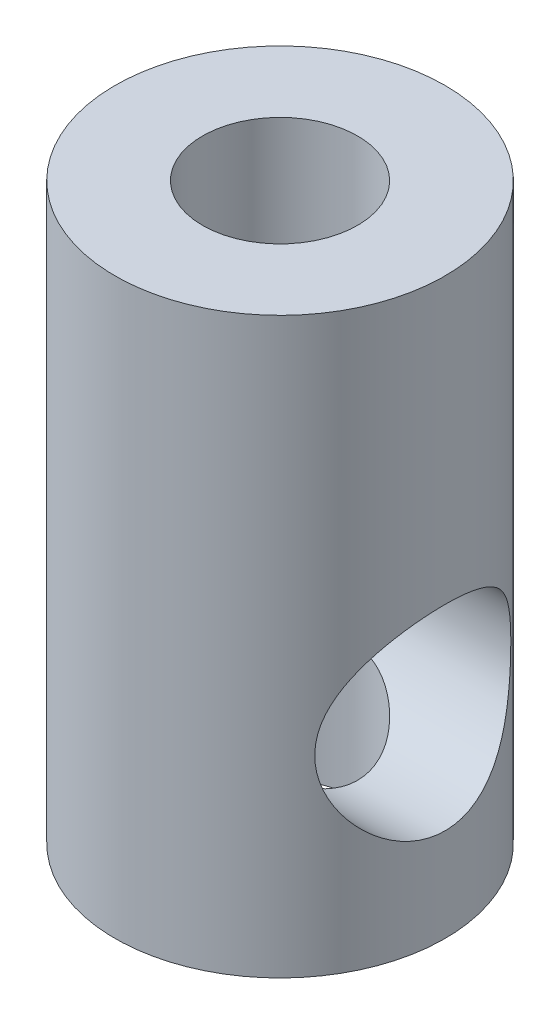
ISO-10303-21;
HEADER;
FILE_DESCRIPTION(('STEP AP214'),'2;1');
FILE_NAME('part.step','',(''),(''),'','','');
FILE_SCHEMA(('AUTOMOTIVE_DESIGN { 1 0 10303 214 1 1 1 1 }'));
ENDSEC;
DATA;
#1=APPLICATION_CONTEXT('core data for automotive mechanical design processes');
#2=APPLICATION_PROTOCOL_DEFINITION('international standard','automotive_design',2000,#1);
#3=PRODUCT_CONTEXT('',#1,'mechanical');
#4=PRODUCT('Part','Part','',(#3));
#5=PRODUCT_RELATED_PRODUCT_CATEGORY('part','',(#4));
#6=PRODUCT_DEFINITION_FORMATION('','',#4);
#7=PRODUCT_DEFINITION_CONTEXT('part definition',#1,'design');
#8=PRODUCT_DEFINITION('design','',#6,#7);
#9=PRODUCT_DEFINITION_SHAPE('','',#8);
#10=(LENGTH_UNIT() NAMED_UNIT(*) SI_UNIT(.MILLI.,.METRE.));
#11=(NAMED_UNIT(*) PLANE_ANGLE_UNIT() SI_UNIT($,.RADIAN.));
#12=(NAMED_UNIT(*) SI_UNIT($,.STERADIAN.) SOLID_ANGLE_UNIT());
#13=UNCERTAINTY_MEASURE_WITH_UNIT(LENGTH_MEASURE(1.E-05),#10,'distance_accuracy_value','');
#14=(GEOMETRIC_REPRESENTATION_CONTEXT(3) GLOBAL_UNCERTAINTY_ASSIGNED_CONTEXT((#13)) GLOBAL_UNIT_ASSIGNED_CONTEXT((#10,
#11,#12)) REPRESENTATION_CONTEXT('',''));
#15=CARTESIAN_POINT('',(0.,0.,0.));
#16=DIRECTION('',(0.,0.,1.));
#17=DIRECTION('',(1.,0.,0.));
#18=AXIS2_PLACEMENT_3D('',#15,#16,#17);
#19=CARTESIAN_POINT('',(0.,0.,0.));
#20=DIRECTION('',(0.,-1.,0.));
#21=DIRECTION('',(0.,0.,-1.));
#22=AXIS2_PLACEMENT_3D('',#19,#20,#21);
#23=CYLINDRICAL_SURFACE('',#22,1.621);
#24=CARTESIAN_POINT('',(0.,2.74506613720085,-1.621));
#25=CARTESIAN_POINT('',(-0.0618838344943443,2.74507314784713,-1.62100303795965));
#26=CARTESIAN_POINT('',(-0.123753923437036,2.74041001839376,-1.61742580648904));
#27=CARTESIAN_POINT('',(-0.245548077429936,2.72269820526634,-1.60347159765317));
#28=CARTESIAN_POINT('',(-0.305467583498045,2.70963117787796,-1.59307974460996));
#29=CARTESIAN_POINT('',(-0.441855724366991,2.67167549543974,-1.56167676736126));
#30=CARTESIAN_POINT('',(-0.517049098267741,2.64428105756333,-1.53826004055569));
#31=CARTESIAN_POINT('',(-0.661104506712127,2.58308809869082,-1.48209063959145));
#32=CARTESIAN_POINT('',(-0.729947369344123,2.54927107144414,-1.44931084533743));
#33=CARTESIAN_POINT('',(-0.883849864405583,2.46687093643185,-1.36260863239398));
#34=CARTESIAN_POINT('',(-0.966412860188456,2.41719066792417,-1.3052891068616));
#35=CARTESIAN_POINT('',(-1.11998184477946,2.31899579598461,-1.17614619810124));
#36=CARTESIAN_POINT('',(-1.19099722423979,2.2704802730153,-1.10433470749768));
#37=CARTESIAN_POINT('',(-1.30741448004819,2.1881341644896,-0.961795820520632));
#38=CARTESIAN_POINT('',(-1.35511379821205,2.15327812500301,-0.893544502039951));
#39=CARTESIAN_POINT('',(-1.44036943977302,2.08983985144661,-0.748356083631552));
#40=CARTESIAN_POINT('',(-1.47794136722123,2.06124797856644,-0.671432607974439));
#41=CARTESIAN_POINT('',(-1.53603227948987,2.01657637847978,-0.523019292399699));
#42=CARTESIAN_POINT('',(-1.5583110113087,1.99923126755153,-0.452603469122464));
#43=CARTESIAN_POINT('',(-1.5931987923943,1.97194135411511,-0.308021253672216));
#44=CARTESIAN_POINT('',(-1.60581302820809,1.96199258237375,-0.233856896000058));
#45=CARTESIAN_POINT('',(-1.62060784053911,1.95031520563182,-0.0835898288305426));
#46=CARTESIAN_POINT('',(-1.62275423239801,1.94861353315467,-0.00748158339559701));
#47=CARTESIAN_POINT('',(-1.61637011622946,1.95365995743185,0.144000645385216));
#48=CARTESIAN_POINT('',(-1.60783889419273,1.96040861925788,0.219374579288184));
#49=CARTESIAN_POINT('',(-1.58137378064278,1.98120338027809,0.363292111490304));
#50=CARTESIAN_POINT('',(-1.56394382245726,1.99485804086783,0.431987821527844));
#51=CARTESIAN_POINT('',(-1.52089453282525,2.02825075136374,0.565176319537256));
#52=CARTESIAN_POINT('',(-1.49527317583841,2.04799030587785,0.629668063213476));
#53=CARTESIAN_POINT('',(-1.43398336321787,2.09455249518729,0.759600226458336));
#54=CARTESIAN_POINT('',(-1.39757254510311,2.12188213081783,0.82450529123297));
#55=CARTESIAN_POINT('',(-1.31735169849772,2.18078779889944,0.947428782374879));
#56=CARTESIAN_POINT('',(-1.27353705925498,2.21236647494132,1.00544287879559));
#57=CARTESIAN_POINT('',(-1.16981404388338,2.28487045121659,1.12547688073274));
#58=CARTESIAN_POINT('',(-1.10844780214715,2.32638463810277,1.18587950931886));
#59=CARTESIAN_POINT('',(-0.977264585306866,2.41023794800863,1.29612932641368));
#60=CARTESIAN_POINT('',(-0.907439330850795,2.45257784464317,1.34596604009144));
#61=CARTESIAN_POINT('',(-0.7684753622988,2.5294639393179,1.42927834909955));
#62=CARTESIAN_POINT('',(-0.700266704048142,2.56433465569014,1.46400152188266));
#63=CARTESIAN_POINT('',(-0.557319490299986,2.6283607645284,1.5241485765311));
#64=CARTESIAN_POINT('',(-0.482590989710124,2.65752474030309,1.54958647471164));
#65=CARTESIAN_POINT('',(-0.340404375629609,2.70115287710556,1.58624516610801));
#66=CARTESIAN_POINT('',(-0.273922199255209,2.71728655323593,1.59916336038962));
#67=CARTESIAN_POINT('',(-0.138281246217461,2.73922227563148,1.61652514107857));
#68=CARTESIAN_POINT('',(-0.0691320460858544,2.74505830542494,1.62099660621602));
#69=CARTESIAN_POINT('',(0.0618838344943542,2.74507314784709,1.62100303795965));
#70=CARTESIAN_POINT('',(0.123753923437046,2.74041001839375,1.61742580648904));
#71=CARTESIAN_POINT('',(0.245548077429942,2.72269820526635,1.60347159765317));
#72=CARTESIAN_POINT('',(0.305467583498048,2.70963117787797,1.59307974460996));
#73=CARTESIAN_POINT('',(0.44185572436699,2.67167549543974,1.56167676736126));
#74=CARTESIAN_POINT('',(0.51704909826774,2.64428105756332,1.53826004055569));
#75=CARTESIAN_POINT('',(0.661104506712126,2.58308809869082,1.48209063959145));
#76=CARTESIAN_POINT('',(0.729947369344122,2.54927107144414,1.44931084533743));
#77=CARTESIAN_POINT('',(0.883849864405583,2.46687093643185,1.36260863239398));
#78=CARTESIAN_POINT('',(0.966412860188457,2.41719066792417,1.3052891068616));
#79=CARTESIAN_POINT('',(1.11998184477946,2.31899579598461,1.17614619810124));
#80=CARTESIAN_POINT('',(1.19099722423979,2.2704802730153,1.10433470749768));
#81=CARTESIAN_POINT('',(1.30741448004819,2.1881341644896,0.961795820520632));
#82=CARTESIAN_POINT('',(1.35511379821205,2.15327812500301,0.893544502039951));
#83=CARTESIAN_POINT('',(1.44036943977302,2.08983985144661,0.748356083631552));
#84=CARTESIAN_POINT('',(1.47794136722123,2.06124797856644,0.671432607974438));
#85=CARTESIAN_POINT('',(1.53603227948987,2.01657637847978,0.523019292399699));
#86=CARTESIAN_POINT('',(1.5583110113087,1.99923126755153,0.452603469122464));
#87=CARTESIAN_POINT('',(1.59319879239431,1.97194135411511,0.308021253672216));
#88=CARTESIAN_POINT('',(1.60581302820809,1.96199258237375,0.233856896000058));
#89=CARTESIAN_POINT('',(1.62060784053911,1.95031520563182,0.0835898288305419));
#90=CARTESIAN_POINT('',(1.62275423239801,1.94861353315467,0.00748158339559628));
#91=CARTESIAN_POINT('',(1.61637011622946,1.95365995743185,-0.144000645385217));
#92=CARTESIAN_POINT('',(1.60783889419273,1.96040861925788,-0.219374579288185));
#93=CARTESIAN_POINT('',(1.58137378064278,1.98120338027809,-0.363292111490305));
#94=CARTESIAN_POINT('',(1.56394382245726,1.99485804086783,-0.431987821527845));
#95=CARTESIAN_POINT('',(1.52089453282525,2.02825075136374,-0.565176319537257));
#96=CARTESIAN_POINT('',(1.4952731758384,2.04799030587785,-0.629668063213477));
#97=CARTESIAN_POINT('',(1.43398336321787,2.09455249518729,-0.759600226458337));
#98=CARTESIAN_POINT('',(1.39757254510311,2.12188213081783,-0.824505291232971));
#99=CARTESIAN_POINT('',(1.31735169849772,2.18078779889944,-0.94742878237488));
#100=CARTESIAN_POINT('',(1.27353705925498,2.21236647494132,-1.00544287879559));
#101=CARTESIAN_POINT('',(1.16981404388338,2.28487045121659,-1.12547688073274));
#102=CARTESIAN_POINT('',(1.10844780214715,2.32638463810277,-1.18587950931886));
#103=CARTESIAN_POINT('',(0.977264585306865,2.41023794800863,-1.29612932641368));
#104=CARTESIAN_POINT('',(0.907439330850794,2.45257784464318,-1.34596604009144));
#105=CARTESIAN_POINT('',(0.768475362298799,2.5294639393179,-1.42927834909955));
#106=CARTESIAN_POINT('',(0.700266704048142,2.56433465569014,-1.46400152188266));
#107=CARTESIAN_POINT('',(0.557319490299986,2.6283607645284,-1.5241485765311));
#108=CARTESIAN_POINT('',(0.482590989710124,2.65752474030309,-1.54958647471164));
#109=CARTESIAN_POINT('',(0.340404375629609,2.70115287710556,-1.58624516610801));
#110=CARTESIAN_POINT('',(0.273922199255209,2.71728655323592,-1.59916336038962));
#111=CARTESIAN_POINT('',(0.138281246217465,2.73922227563149,-1.61652514107857));
#112=CARTESIAN_POINT('',(0.0691320460858617,2.74505830542497,-1.62099660621601));
#113=CARTESIAN_POINT('',(0.,2.74506613720085,-1.621));
#114=B_SPLINE_CURVE_WITH_KNOTS('',3,(#24,#25,#26,#27,#28,#29,#30,#31,#32,#33,#34,#35,#36,#37,
#38,#39,#40,#41,#42,#43,#44,#45,#46,#47,#48,#49,#50,#51,#52,#53,#54,#55,#56,#57,#58,#59,#60,#61,
#62,#63,#64,#65,#66,#67,#68,#69,#70,#71,#72,#73,#74,#75,#76,#77,#78,#79,#80,#81,#82,#83,#84,#85,
#86,#87,#88,#89,#90,#91,#92,#93,#94,#95,#96,#97,#98,#99,#100,#101,#102,#103,#104,#105,#106,#107,
#108,#109,#110,#111,#112,#113),.UNSPECIFIED.,.T.,.F.,(4,2,2,2,2,2,2,2,2,2,2,2,2,2,2,2,2,2,2,2,2,
2,2,2,2,2,2,2,2,2,2,2,2,2,2,2,2,2,2,2,2,2,2,2,4),(0.,0.185377660843626,0.371161336779442,
0.619921094874963,0.869408821243558,1.20414561890691,1.53860882854341,1.80839015749153,
2.07775340616949,2.30438341449147,2.53089171422933,2.75813922518544,2.98540193293617,
3.20102541609755,3.41670225917006,3.65367977493349,3.89080541674557,4.17654691448938,
4.46257037937714,4.71414744690372,4.96534316757062,5.17312037153082,5.38021059303128,
5.5655882538749,5.75137192981071,6.00013168790622,6.24961941427482,6.58435621193818,
6.91881942157467,7.18860075052279,7.45796399920075,7.68459400752273,7.9111023072606,
8.13834981821671,8.36561252596743,8.58123600912882,8.79691285220133,9.03389036796476,
9.27101600977684,9.55675750752065,9.84278097240841,10.094358039935,10.3455537606019,
10.5533309645621,10.7604211860625),.UNSPECIFIED.);
#115=CARTESIAN_POINT('',(0.,2.74506613720085,-1.621));
#116=VERTEX_POINT('',#115);
#117=EDGE_CURVE('E53',#116,#116,#114,.T.);
#118=ORIENTED_EDGE('',*,*,#117,.T.);
#119=EDGE_LOOP('',(#118));
#120=FACE_BOUND('',#119,.T.);
#121=CARTESIAN_POINT('',(0.,0.,0.));
#122=DIRECTION('',(0.,-1.,0.));
#123=DIRECTION('',(0.,0.,-1.));
#124=AXIS2_PLACEMENT_3D('',#121,#122,#123);
#125=CIRCLE('',#124,1.621);
#126=CARTESIAN_POINT('',(0.,0.,-1.621));
#127=VERTEX_POINT('',#126);
#128=EDGE_CURVE('E115',#127,#127,#125,.T.);
#129=ORIENTED_EDGE('',*,*,#128,.T.);
#130=EDGE_LOOP('',(#129));
#131=FACE_BOUND('',#130,.T.);
#132=ADVANCED_FACE('F49',(#120,#131),#23,.F.);
#133=CARTESIAN_POINT('',(-3.45,4.,0.));
#134=DIRECTION('',(1.,0.,0.));
#135=DIRECTION('',(0.,0.,-1.));
#136=AXIS2_PLACEMENT_3D('',#133,#134,#135);
#137=CYLINDRICAL_SURFACE('',#136,2.05);
#138=CARTESIAN_POINT('',(0.,5.25493386279916,1.62099999999999));
#139=CARTESIAN_POINT('',(-0.0618830330495489,5.25492889918169,1.62100214032641));
#140=CARTESIAN_POINT('',(-0.123755996479579,5.25959073995909,1.61742540841188));
#141=CARTESIAN_POINT('',(-0.245551219828907,5.27730179462162,1.60347139817654));
#142=CARTESIAN_POINT('',(-0.30546900533672,5.29036899863706,1.59307953238345));
#143=CARTESIAN_POINT('',(-0.441854610423959,5.32832448802651,1.56167686966186));
#144=CARTESIAN_POINT('',(-0.517047347609583,5.35571839087182,1.53826053845071));
#145=CARTESIAN_POINT('',(-0.661103028524226,5.41691108038444,1.48209140158255));
#146=CARTESIAN_POINT('',(-0.729946653059148,5.45072851563303,1.44931126805409));
#147=CARTESIAN_POINT('',(-0.883850180507783,5.53312927228377,1.36260842856593));
#148=CARTESIAN_POINT('',(-0.966413492435413,5.58280972225945,1.30528866079276));
#149=CARTESIAN_POINT('',(-1.11998239987942,5.68100457275356,1.17614564592379));
#150=CARTESIAN_POINT('',(-1.19099747457449,5.72951990147346,1.10433440354057));
#151=CARTESIAN_POINT('',(-1.30741442747507,5.8118658004062,0.961795882835193));
#152=CARTESIAN_POINT('',(-1.35511370389337,5.84672180667136,0.893544636434798));
#153=CARTESIAN_POINT('',(-1.44036936613832,5.91016009190644,0.74835623515854));
#154=CARTESIAN_POINT('',(-1.4779413362639,5.93875199748061,0.671432687310931));
#155=CARTESIAN_POINT('',(-1.53603229081255,5.98342363035093,0.523019263265586));
#156=CARTESIAN_POINT('',(-1.5583110303885,6.00076874732406,0.452603408683053));
#157=CARTESIAN_POINT('',(-1.59319880325188,6.02805865442715,0.308021190085523));
#158=CARTESIAN_POINT('',(-1.60581303133965,6.03800742010654,0.233856863808264));
#159=CARTESIAN_POINT('',(-1.6206078367329,6.0496847913554,0.0835898678755999));
#160=CARTESIAN_POINT('',(-1.62275423035395,6.0513864651685,0.00748166244067034));
#161=CARTESIAN_POINT('',(-1.616370124903,6.04634004948564,-0.144000567138135));
#162=CARTESIAN_POINT('',(-1.60783890077889,6.03959138617865,-0.219374541074549));
#163=CARTESIAN_POINT('',(-1.58137378012164,6.01879661906433,-0.363292116599426));
#164=CARTESIAN_POINT('',(-1.56394382140614,6.00514195739511,-0.431987831327662));
#165=CARTESIAN_POINT('',(-1.52089452760981,5.97174924550825,-0.565176329128339));
#166=CARTESIAN_POINT('',(-1.49527316817564,5.95200969156516,-0.629668068517935));
#167=CARTESIAN_POINT('',(-1.43398316810272,5.90544735299585,-0.759600652116186));
#168=CARTESIAN_POINT('',(-1.39757211222425,5.87811753048299,-0.824506101761588));
#169=CARTESIAN_POINT('',(-1.31735112292729,5.81921179934006,-0.947429516871564));
#170=CARTESIAN_POINT('',(-1.27353667123426,5.78763330016539,-1.00544323928693));
#171=CARTESIAN_POINT('',(-1.16981732669034,5.71513178767887,-1.12547318838376));
#172=CARTESIAN_POINT('',(-1.10845512396213,5.67362009730251,-1.18587266023303));
#173=CARTESIAN_POINT('',(-0.977271968834751,5.58976671268696,-1.29612381826176));
#174=CARTESIAN_POINT('',(-0.907441796666579,5.54742415661406,-1.34596384240431));
#175=CARTESIAN_POINT('',(-0.768454020406526,5.47052369220059,-1.42929177700902));
#176=CARTESIAN_POINT('',(-0.700224043684187,5.4356417709281,-1.46402500173882));
#177=CARTESIAN_POINT('',(-0.557261588228808,5.37161775450909,-1.52416742519672));
#178=CARTESIAN_POINT('',(-0.482543855505317,5.34246311004278,-1.54959711730513));
#179=CARTESIAN_POINT('',(-0.3488371866511,5.30143295920477,-1.58407209628777));
#180=CARTESIAN_POINT('',(-0.291322382051613,5.28700429614235,-1.59571297827185));
#181=CARTESIAN_POINT('',(-0.174053268851574,5.26564342969819,-1.61271180043318));
#182=CARTESIAN_POINT('',(-0.114303858671364,5.2586957218473,-1.61808273718418));
#183=CARTESIAN_POINT('',(0.00610377366413654,5.25350316750355,-1.62211120435333));
#184=CARTESIAN_POINT('',(0.0667649395882279,5.25529918211992,-1.62073721417151));
#185=CARTESIAN_POINT('',(0.186743463703107,5.26733881274003,-1.61133604094995));
#186=CARTESIAN_POINT('',(0.246058688971207,5.27759498939371,-1.60329896525788));
#187=CARTESIAN_POINT('',(0.378029533759793,5.3086510349792,-1.57810805759646));
#188=CARTESIAN_POINT('',(0.449797430601423,5.33159241834356,-1.55903801762583));
#189=CARTESIAN_POINT('',(0.587877981473662,5.38432475684989,-1.51241015736106));
#190=CARTESIAN_POINT('',(0.654174078509453,5.41413553515476,-1.48482769286972));
#191=CARTESIAN_POINT('',(0.807953506978125,5.49046420986335,-1.40889626274167));
#192=CARTESIAN_POINT('',(0.892655943344169,5.53874411889626,-1.35668986630306));
#193=CARTESIAN_POINT('',(1.05111007655166,5.63578929914672,-1.23798499705547));
#194=CARTESIAN_POINT('',(1.12485035324314,5.68455502083611,-1.17147179373758));
#195=CARTESIAN_POINT('',(1.26089163408736,5.77827631797998,-1.02370473941556));
#196=CARTESIAN_POINT('',(1.32307401507183,5.82319007901757,-0.942313406154192));
#197=CARTESIAN_POINT('',(1.43228266169034,5.9039303077775,-0.766070062745339));
#198=CARTESIAN_POINT('',(1.47935885986475,5.93978662887907,-0.671263923785083));
#199=CARTESIAN_POINT('',(1.54261773466839,5.98853499246691,-0.503220178930186));
#200=CARTESIAN_POINT('',(1.5638679604424,6.00510346159556,-0.432938636689425));
#201=CARTESIAN_POINT('',(1.59676230394665,6.03086230537072,-0.288851051988581));
#202=CARTESIAN_POINT('',(1.60841361450421,6.04005820442156,-0.215047692512681));
#203=CARTESIAN_POINT('',(1.62140422788307,6.05031577543763,-0.0657382658470276));
#204=CARTESIAN_POINT('',(1.62271209859861,6.05135265335801,0.00977229260505782));
#205=CARTESIAN_POINT('',(1.61484481788687,6.04513496258799,0.159901550024474));
#206=CARTESIAN_POINT('',(1.60566812622582,6.0378791756643,0.234520116326395));
#207=CARTESIAN_POINT('',(1.57803936732593,6.01618411472832,0.377509343320892));
#208=CARTESIAN_POINT('',(1.56000044842438,6.00206508275369,0.446010733770843));
#209=CARTESIAN_POINT('',(1.51579057609565,5.96781229907152,0.578720243658588));
#210=CARTESIAN_POINT('',(1.48961756773055,5.94767702751408,0.642927273213235));
#211=CARTESIAN_POINT('',(1.42708423145257,5.90025501239669,0.772511008436384));
#212=CARTESIAN_POINT('',(1.38994864417285,5.87244300789281,0.837317804438033));
#213=CARTESIAN_POINT('',(1.30827504950294,5.81264140107754,0.959944811141948));
#214=CARTESIAN_POINT('',(1.2637321230162,5.78064902569327,1.01776033468806));
#215=CARTESIAN_POINT('',(1.15829718368978,5.70727405147842,1.13736467721005));
#216=CARTESIAN_POINT('',(1.09592944450333,5.66531836035746,1.19749944593213));
#217=CARTESIAN_POINT('',(0.962663407540083,5.58079323638569,1.30704831575405));
#218=CARTESIAN_POINT('',(0.89175737698168,5.53822327839336,1.35645258342963));
#219=CARTESIAN_POINT('',(0.752359411390864,5.46218916203854,1.43775553281014));
#220=CARTESIAN_POINT('',(0.684976630172156,5.42829414723995,1.47114807536486));
#221=CARTESIAN_POINT('',(0.543932986788266,5.36628181427758,1.52890945878704));
#222=CARTESIAN_POINT('',(0.470282855947682,5.3381548905017,1.55329335696118));
#223=CARTESIAN_POINT('',(0.330952795152719,5.29646665225007,1.58817023124629));
#224=CARTESIAN_POINT('',(0.266239164139942,5.28119135627848,1.60037755212961));
#225=CARTESIAN_POINT('',(0.134341167077993,5.2604420451946,1.61677950974833));
#226=CARTESIAN_POINT('',(0.0671646526277055,5.25493925005358,1.62099767700008));
#227=CARTESIAN_POINT('',(0.,5.25493386279916,1.62099999999999));
#228=B_SPLINE_CURVE_WITH_KNOTS('',3,(#138,#139,#140,#141,#142,#143,#144,#145,#146,#147,#148,
#149,#150,#151,#152,#153,#154,#155,#156,#157,#158,#159,#160,#161,#162,#163,#164,#165,#166,#167,
#168,#169,#170,#171,#172,#173,#174,#175,#176,#177,#178,#179,#180,#181,#182,#183,#184,#185,#186,
#187,#188,#189,#190,#191,#192,#193,#194,#195,#196,#197,#198,#199,#200,#201,#202,#203,#204,#205,
#206,#207,#208,#209,#210,#211,#212,#213,#214,#215,#216,#217,#218,#219,#220,#221,#222,#223,#224,
#225,#226,#227),.UNSPECIFIED.,.T.,.F.,(4,2,2,2,2,2,2,2,2,2,2,2,2,2,2,2,2,2,2,2,2,2,2,2,2,2,2,2,
2,2,2,2,2,2,2,2,2,2,2,2,2,2,2,2,4),(0.,0.185381616549972,0.371161334490021,0.619918309503557,
0.869408821531492,1.20414690848627,1.53860882897815,1.80838989326253,2.07775340646692,
2.30438351163773,2.53089171455724,2.75813910800171,2.98540193327238,3.20102543208312,
3.41670225950147,3.6536812612653,3.89080541659522,4.17653093149088,4.46257038034193,
4.71423568196704,4.96534324109541,5.14594567536399,5.32617308175895,5.50724353198713,
5.68858329913331,5.92044827887146,6.1529909265456,6.48309963883762,6.81354987714128,
7.14722406649036,7.47978367546371,7.7046615810701,7.92937082356064,8.15476266111802,
8.38018761410257,8.59597889835669,8.81182474294718,9.05006699291498,9.28846809225648,
9.57620848530387,9.86421146121221,10.1109589542016,10.3572921402497,10.5590910762084,
10.7602947222735),.UNSPECIFIED.);
#229=CARTESIAN_POINT('',(0.,5.25493386279916,1.62099999999999));
#230=VERTEX_POINT('',#229);
#231=EDGE_CURVE('E120',#230,#230,#228,.T.);
#232=ORIENTED_EDGE('',*,*,#231,.F.);
#233=EDGE_LOOP('',(#232));
#234=FACE_BOUND('',#233,.T.);
#235=CARTESIAN_POINT('',(-2.77488738510232,4.,2.05));
#236=CARTESIAN_POINT('',(-2.77489143393681,3.89663578491721,2.04999751277487));
#237=CARTESIAN_POINT('',(-2.78075382388587,3.79325437500086,2.04212997172924));
#238=CARTESIAN_POINT('',(-2.80319095394179,3.58994792576057,2.01120947430331));
#239=CARTESIAN_POINT('',(-2.81977869035129,3.49002723488545,1.98813809421198));
#240=CARTESIAN_POINT('',(-2.86099956660419,3.29702527173235,1.92833464247161));
#241=CARTESIAN_POINT('',(-2.88557503963835,3.20390066769099,1.89170023193819));
#242=CARTESIAN_POINT('',(-2.93990031601834,3.02517778436712,1.80611491729768));
#243=CARTESIAN_POINT('',(-2.96965169787961,2.93958181314335,1.75716025379903));
#244=CARTESIAN_POINT('',(-3.03528078749033,2.7671024794558,1.6414925013206));
#245=CARTESIAN_POINT('',(-3.07146557480204,2.68129069370902,1.57335539137369));
#246=CARTESIAN_POINT('',(-3.14341900615699,2.52142663611085,1.42417854055656));
#247=CARTESIAN_POINT('',(-3.17918733183335,2.44738287522702,1.3431295455101));
#248=CARTESIAN_POINT('',(-3.2507454613309,2.30545318258062,1.16007998696332));
#249=CARTESIAN_POINT('',(-3.28614148760711,2.23903504295877,1.0567721935483));
#250=CARTESIAN_POINT('',(-3.34861893795642,2.12502685242944,0.837945244070723));
#251=CARTESIAN_POINT('',(-3.37570778937931,2.07741997153734,0.722437121164436));
#252=CARTESIAN_POINT('',(-3.41623599660832,2.00716061371986,0.493963332768772));
#253=CARTESIAN_POINT('',(-3.43071920770604,1.98258277834576,0.381779664167375));
#254=CARTESIAN_POINT('',(-3.44844472323343,1.95258064813637,0.15404091057593));
#255=CARTESIAN_POINT('',(-3.45169733581108,1.94713878901676,0.0384890154691252));
#256=CARTESIAN_POINT('',(-3.44691481696331,1.95519688732065,-0.1775459264577));
#257=CARTESIAN_POINT('',(-3.44020504576054,1.96647253351257,-0.278151654723405));
#258=CARTESIAN_POINT('',(-3.41848665906978,2.00343417951739,-0.475736996500932));
#259=CARTESIAN_POINT('',(-3.40347743245066,2.02912124051813,-0.572716342422266));
#260=CARTESIAN_POINT('',(-3.36634053642459,2.09396822032481,-0.761287110846904));
#261=CARTESIAN_POINT('',(-3.34416736999643,2.13321436417511,-0.852839547639698));
#262=CARTESIAN_POINT('',(-3.2944893894688,2.22374246175478,-1.02818050469654));
#263=CARTESIAN_POINT('',(-3.26698314463927,2.27502764603403,-1.11196693260147));
#264=CARTESIAN_POINT('',(-3.20515249271778,2.39502128496743,-1.28001118436979));
#265=CARTESIAN_POINT('',(-3.17040647450803,2.46507266408615,-1.36315408489345));
#266=CARTESIAN_POINT('',(-3.0996413791566,2.61713706063045,-1.51721046681026));
#267=CARTESIAN_POINT('',(-3.06362066198332,2.69916594617044,-1.58810744818468));
#268=CARTESIAN_POINT('',(-2.98963648835672,2.88380968978909,-1.72371128858937));
#269=CARTESIAN_POINT('',(-2.95191066711962,2.98770239727529,-1.78682336885537));
#270=CARTESIAN_POINT('',(-2.88410862163228,3.20699389859274,-1.89432845584547));
#271=CARTESIAN_POINT('',(-2.85401817581997,3.32237073552277,-1.93875636651866));
#272=CARTESIAN_POINT('',(-2.81275685809301,3.53167775826355,-1.99796367759949));
#273=CARTESIAN_POINT('',(-2.79873407253478,3.62373335929514,-2.01738359688765));
#274=CARTESIAN_POINT('',(-2.77980209532251,3.81052303228283,-2.0433964025447));
#275=CARTESIAN_POINT('',(-2.77488367385963,3.90525429265861,-2.05000227984031));
#276=CARTESIAN_POINT('',(-2.77489143393681,4.10336421508279,-2.04999751277487));
#277=CARTESIAN_POINT('',(-2.78075382388587,4.20674562499914,-2.04212997172924));
#278=CARTESIAN_POINT('',(-2.80319095394179,4.41005207423943,-2.01120947430331));
#279=CARTESIAN_POINT('',(-2.81977869035129,4.50997276511455,-1.98813809421198));
#280=CARTESIAN_POINT('',(-2.86099956660419,4.70297472826765,-1.92833464247161));
#281=CARTESIAN_POINT('',(-2.88557503963835,4.79609933230901,-1.89170023193819));
#282=CARTESIAN_POINT('',(-2.93990031601834,4.97482221563288,-1.80611491729768));
#283=CARTESIAN_POINT('',(-2.96965169787961,5.06041818685665,-1.75716025379903));
#284=CARTESIAN_POINT('',(-3.03528078749033,5.2328975205442,-1.6414925013206));
#285=CARTESIAN_POINT('',(-3.07146557480204,5.31870930629098,-1.57335539137369));
#286=CARTESIAN_POINT('',(-3.14341900615699,5.47857336388915,-1.42417854055656));
#287=CARTESIAN_POINT('',(-3.17918733183335,5.55261712477298,-1.3431295455101));
#288=CARTESIAN_POINT('',(-3.2507454613309,5.69454681741938,-1.16007998696332));
#289=CARTESIAN_POINT('',(-3.28614148760711,5.76096495704123,-1.0567721935483));
#290=CARTESIAN_POINT('',(-3.34861893795642,5.87497314757056,-0.837945244070723));
#291=CARTESIAN_POINT('',(-3.37570778937931,5.92258002846266,-0.722437121164437));
#292=CARTESIAN_POINT('',(-3.41623599660832,5.99283938628014,-0.493963332768773));
#293=CARTESIAN_POINT('',(-3.43071920770604,6.01741722165424,-0.381779664167376));
#294=CARTESIAN_POINT('',(-3.44844472323343,6.04741935186363,-0.15404091057593));
#295=CARTESIAN_POINT('',(-3.45169733581108,6.05286121098324,-0.0384890154691254));
#296=CARTESIAN_POINT('',(-3.44691481696331,6.04480311267935,0.1775459264577));
#297=CARTESIAN_POINT('',(-3.44020504576054,6.03352746648743,0.278151654723405));
#298=CARTESIAN_POINT('',(-3.41848665906978,5.99656582048261,0.475736996500931));
#299=CARTESIAN_POINT('',(-3.40347743245066,5.97087875948187,0.572716342422265));
#300=CARTESIAN_POINT('',(-3.36634053642459,5.90603177967519,0.761287110846903));
#301=CARTESIAN_POINT('',(-3.34416736999643,5.86678563582489,0.852839547639697));
#302=CARTESIAN_POINT('',(-3.2944893894688,5.77625753824522,1.02818050469654));
#303=CARTESIAN_POINT('',(-3.26698314463927,5.72497235396597,1.11196693260147));
#304=CARTESIAN_POINT('',(-3.20515249271778,5.60497871503257,1.28001118436979));
#305=CARTESIAN_POINT('',(-3.17040647450803,5.53492733591385,1.36315408489345));
#306=CARTESIAN_POINT('',(-3.0996413791566,5.38286293936956,1.51721046681026));
#307=CARTESIAN_POINT('',(-3.06362066198332,5.30083405382956,1.58810744818468));
#308=CARTESIAN_POINT('',(-2.98963648835672,5.11619031021091,1.72371128858937));
#309=CARTESIAN_POINT('',(-2.95191066711962,5.01229760272471,1.78682336885537));
#310=CARTESIAN_POINT('',(-2.88410862163228,4.79300610140726,1.89432845584547));
#311=CARTESIAN_POINT('',(-2.85401817581997,4.67762926447723,1.93875636651866));
#312=CARTESIAN_POINT('',(-2.81275685809301,4.46832224173645,1.99796367759949));
#313=CARTESIAN_POINT('',(-2.79873407253478,4.37626664070486,2.01738359688765));
#314=CARTESIAN_POINT('',(-2.77980209532251,4.18947696771717,2.0433964025447));
#315=CARTESIAN_POINT('',(-2.77488367385963,4.09474570734139,2.05000227984031));
#316=CARTESIAN_POINT('',(-2.77488738510232,4.,2.05));
#317=B_SPLINE_CURVE_WITH_KNOTS('',3,(#235,#236,#237,#238,#239,#240,#241,#242,#243,#244,#245,
#246,#247,#248,#249,#250,#251,#252,#253,#254,#255,#256,#257,#258,#259,#260,#261,#262,#263,#264,
#265,#266,#267,#268,#269,#270,#271,#272,#273,#274,#275,#276,#277,#278,#279,#280,#281,#282,#283,
#284,#285,#286,#287,#288,#289,#290,#291,#292,#293,#294,#295,#296,#297,#298,#299,#300,#301,#302,
#303,#304,#305,#306,#307,#308,#309,#310,#311,#312,#313,#314,#315,#316),.UNSPECIFIED.,.T.,.F.,(4,
2,2,2,2,2,2,2,2,2,2,2,2,2,2,2,2,2,2,2,2,2,2,2,2,2,2,2,2,2,2,2,2,2,2,2,2,2,2,2,4),(0.,
0.309689114216517,0.619754195345794,0.92762873895306,1.23559734128545,1.58041776661659,
1.9254864519965,2.30686498648646,2.68790153390397,3.03311352973234,3.37800858397734,
3.68093596068288,3.9838856464437,4.28879843546481,4.59379313834417,4.93483887836356,
5.27634061466023,5.65627826045167,6.03550295651628,6.31965842273558,6.60352566014335,
6.91321477435987,7.22327985548914,7.53115439909641,7.8391230014288,8.18394342675994,
8.52901211213985,8.91039064662981,9.29142719404732,9.63663918987569,9.98153424412068,
10.2844616208262,10.5874113065871,10.8923240956082,11.1973187984875,11.5383645385069,
11.8798662748036,12.259803920595,12.6390286166596,12.9231840828789,13.2070513202867),.UNSPECIFIED.);
#318=CARTESIAN_POINT('',(-2.77488738510232,4.,2.05));
#319=VERTEX_POINT('',#318);
#320=EDGE_CURVE('E77',#319,#319,#317,.T.);
#321=ORIENTED_EDGE('',*,*,#320,.F.);
#322=EDGE_LOOP('',(#321));
#323=FACE_BOUND('',#322,.T.);
#324=CARTESIAN_POINT('',(2.77488738510232,4.,-2.05));
#325=CARTESIAN_POINT('',(2.77489143393681,3.89663578491721,-2.04999751277487));
#326=CARTESIAN_POINT('',(2.78075382388587,3.79325437500086,-2.04212997172924));
#327=CARTESIAN_POINT('',(2.80319095394179,3.58994792576057,-2.01120947430331));
#328=CARTESIAN_POINT('',(2.81977869035129,3.49002723488545,-1.98813809421198));
#329=CARTESIAN_POINT('',(2.86099956660419,3.29702527173235,-1.92833464247161));
#330=CARTESIAN_POINT('',(2.88557503963835,3.20390066769099,-1.89170023193819));
#331=CARTESIAN_POINT('',(2.93990031601834,3.02517778436712,-1.80611491729768));
#332=CARTESIAN_POINT('',(2.96965169787961,2.93958181314335,-1.75716025379903));
#333=CARTESIAN_POINT('',(3.03528078749033,2.7671024794558,-1.6414925013206));
#334=CARTESIAN_POINT('',(3.07146557480204,2.68129069370902,-1.57335539137369));
#335=CARTESIAN_POINT('',(3.14341900615699,2.52142663611085,-1.42417854055656));
#336=CARTESIAN_POINT('',(3.17918733183335,2.44738287522702,-1.3431295455101));
#337=CARTESIAN_POINT('',(3.2507454613309,2.30545318258062,-1.16007998696332));
#338=CARTESIAN_POINT('',(3.28614148760711,2.23903504295877,-1.0567721935483));
#339=CARTESIAN_POINT('',(3.34861893795642,2.12502685242944,-0.837945244070723));
#340=CARTESIAN_POINT('',(3.37570778937931,2.07741997153734,-0.722437121164436));
#341=CARTESIAN_POINT('',(3.41623599660832,2.00716061371986,-0.493963332768772));
#342=CARTESIAN_POINT('',(3.43071920770604,1.98258277834576,-0.381779664167375));
#343=CARTESIAN_POINT('',(3.44844472323343,1.95258064813637,-0.15404091057593));
#344=CARTESIAN_POINT('',(3.45169733581108,1.94713878901676,-0.0384890154691252));
#345=CARTESIAN_POINT('',(3.44691481696331,1.95519688732065,0.1775459264577));
#346=CARTESIAN_POINT('',(3.44020504576054,1.96647253351257,0.278151654723405));
#347=CARTESIAN_POINT('',(3.41848665906978,2.00343417951739,0.475736996500932));
#348=CARTESIAN_POINT('',(3.40347743245066,2.02912124051813,0.572716342422266));
#349=CARTESIAN_POINT('',(3.36634053642459,2.09396822032481,0.761287110846904));
#350=CARTESIAN_POINT('',(3.34416736999643,2.13321436417511,0.852839547639698));
#351=CARTESIAN_POINT('',(3.2944893894688,2.22374246175478,1.02818050469654));
#352=CARTESIAN_POINT('',(3.26698314463927,2.27502764603403,1.11196693260147));
#353=CARTESIAN_POINT('',(3.20515249271778,2.39502128496743,1.28001118436979));
#354=CARTESIAN_POINT('',(3.17040647450803,2.46507266408615,1.36315408489345));
#355=CARTESIAN_POINT('',(3.0996413791566,2.61713706063045,1.51721046681026));
#356=CARTESIAN_POINT('',(3.06362066198332,2.69916594617044,1.58810744818468));
#357=CARTESIAN_POINT('',(2.98963648835672,2.88380968978909,1.72371128858937));
#358=CARTESIAN_POINT('',(2.95191066711962,2.98770239727529,1.78682336885537));
#359=CARTESIAN_POINT('',(2.88410862163228,3.20699389859274,1.89432845584547));
#360=CARTESIAN_POINT('',(2.85401817581997,3.32237073552277,1.93875636651866));
#361=CARTESIAN_POINT('',(2.81275685809301,3.53167775826355,1.99796367759949));
#362=CARTESIAN_POINT('',(2.79873407253478,3.62373335929514,2.01738359688765));
#363=CARTESIAN_POINT('',(2.77980209532251,3.81052303228283,2.0433964025447));
#364=CARTESIAN_POINT('',(2.77488367385963,3.90525429265861,2.05000227984031));
#365=CARTESIAN_POINT('',(2.77489143393681,4.10336421508279,2.04999751277487));
#366=CARTESIAN_POINT('',(2.78075382388587,4.20674562499914,2.04212997172924));
#367=CARTESIAN_POINT('',(2.80319095394179,4.41005207423943,2.01120947430331));
#368=CARTESIAN_POINT('',(2.81977869035129,4.50997276511455,1.98813809421198));
#369=CARTESIAN_POINT('',(2.86099956660419,4.70297472826765,1.92833464247161));
#370=CARTESIAN_POINT('',(2.88557503963835,4.79609933230901,1.89170023193819));
#371=CARTESIAN_POINT('',(2.93990031601834,4.97482221563288,1.80611491729768));
#372=CARTESIAN_POINT('',(2.96965169787961,5.06041818685665,1.75716025379903));
#373=CARTESIAN_POINT('',(3.03528078749033,5.2328975205442,1.6414925013206));
#374=CARTESIAN_POINT('',(3.07146557480204,5.31870930629098,1.57335539137369));
#375=CARTESIAN_POINT('',(3.14341900615699,5.47857336388915,1.42417854055656));
#376=CARTESIAN_POINT('',(3.17918733183335,5.55261712477298,1.3431295455101));
#377=CARTESIAN_POINT('',(3.2507454613309,5.69454681741938,1.16007998696332));
#378=CARTESIAN_POINT('',(3.28614148760711,5.76096495704123,1.0567721935483));
#379=CARTESIAN_POINT('',(3.34861893795642,5.87497314757056,0.837945244070723));
#380=CARTESIAN_POINT('',(3.37570778937931,5.92258002846266,0.722437121164437));
#381=CARTESIAN_POINT('',(3.41623599660832,5.99283938628014,0.493963332768773));
#382=CARTESIAN_POINT('',(3.43071920770604,6.01741722165424,0.381779664167376));
#383=CARTESIAN_POINT('',(3.44844472323343,6.04741935186363,0.15404091057593));
#384=CARTESIAN_POINT('',(3.45169733581108,6.05286121098324,0.0384890154691254));
#385=CARTESIAN_POINT('',(3.44691481696331,6.04480311267935,-0.1775459264577));
#386=CARTESIAN_POINT('',(3.44020504576054,6.03352746648743,-0.278151654723405));
#387=CARTESIAN_POINT('',(3.41848665906978,5.99656582048261,-0.475736996500931));
#388=CARTESIAN_POINT('',(3.40347743245066,5.97087875948187,-0.572716342422265));
#389=CARTESIAN_POINT('',(3.36634053642459,5.90603177967519,-0.761287110846903));
#390=CARTESIAN_POINT('',(3.34416736999643,5.86678563582489,-0.852839547639697));
#391=CARTESIAN_POINT('',(3.2944893894688,5.77625753824522,-1.02818050469654));
#392=CARTESIAN_POINT('',(3.26698314463927,5.72497235396597,-1.11196693260147));
#393=CARTESIAN_POINT('',(3.20515249271778,5.60497871503257,-1.28001118436979));
#394=CARTESIAN_POINT('',(3.17040647450803,5.53492733591385,-1.36315408489345));
#395=CARTESIAN_POINT('',(3.0996413791566,5.38286293936956,-1.51721046681026));
#396=CARTESIAN_POINT('',(3.06362066198332,5.30083405382956,-1.58810744818468));
#397=CARTESIAN_POINT('',(2.98963648835672,5.11619031021091,-1.72371128858937));
#398=CARTESIAN_POINT('',(2.95191066711962,5.01229760272471,-1.78682336885537));
#399=CARTESIAN_POINT('',(2.88410862163228,4.79300610140726,-1.89432845584547));
#400=CARTESIAN_POINT('',(2.85401817581997,4.67762926447723,-1.93875636651866));
#401=CARTESIAN_POINT('',(2.81275685809301,4.46832224173645,-1.99796367759949));
#402=CARTESIAN_POINT('',(2.79873407253478,4.37626664070486,-2.01738359688765));
#403=CARTESIAN_POINT('',(2.77980209532251,4.18947696771717,-2.0433964025447));
#404=CARTESIAN_POINT('',(2.77488367385963,4.09474570734139,-2.05000227984031));
#405=CARTESIAN_POINT('',(2.77488738510232,4.,-2.05));
#406=B_SPLINE_CURVE_WITH_KNOTS('',3,(#324,#325,#326,#327,#328,#329,#330,#331,#332,#333,#334,
#335,#336,#337,#338,#339,#340,#341,#342,#343,#344,#345,#346,#347,#348,#349,#350,#351,#352,#353,
#354,#355,#356,#357,#358,#359,#360,#361,#362,#363,#364,#365,#366,#367,#368,#369,#370,#371,#372,
#373,#374,#375,#376,#377,#378,#379,#380,#381,#382,#383,#384,#385,#386,#387,#388,#389,#390,#391,
#392,#393,#394,#395,#396,#397,#398,#399,#400,#401,#402,#403,#404,#405),.UNSPECIFIED.,.T.,.F.,(4,
2,2,2,2,2,2,2,2,2,2,2,2,2,2,2,2,2,2,2,2,2,2,2,2,2,2,2,2,2,2,2,2,2,2,2,2,2,2,2,4),(0.,
0.309689114216517,0.619754195345794,0.92762873895306,1.23559734128545,1.58041776661659,
1.9254864519965,2.30686498648646,2.68790153390397,3.03311352973234,3.37800858397734,
3.68093596068288,3.9838856464437,4.28879843546481,4.59379313834417,4.93483887836356,
5.27634061466023,5.65627826045167,6.03550295651628,6.31965842273558,6.60352566014335,
6.91321477435987,7.22327985548914,7.53115439909641,7.8391230014288,8.18394342675994,
8.52901211213985,8.91039064662981,9.29142719404732,9.63663918987569,9.98153424412068,
10.2844616208262,10.5874113065871,10.8923240956082,11.1973187984875,11.5383645385069,
11.8798662748036,12.259803920595,12.6390286166596,12.9231840828789,13.2070513202867),.UNSPECIFIED.);
#407=CARTESIAN_POINT('',(2.77488738510232,4.,-2.05));
#408=VERTEX_POINT('',#407);
#409=EDGE_CURVE('E65',#408,#408,#406,.T.);
#410=ORIENTED_EDGE('',*,*,#409,.F.);
#411=EDGE_LOOP('',(#410));
#412=FACE_BOUND('',#411,.T.);
#413=ORIENTED_EDGE('',*,*,#117,.F.);
#414=EDGE_LOOP('',(#413));
#415=FACE_BOUND('',#414,.T.);
#416=ADVANCED_FACE('F81',(#234,#323,#412,#415),#137,.F.);
#417=CARTESIAN_POINT('',(0.,12.,0.));
#418=DIRECTION('',(0.,1.,0.));
#419=DIRECTION('',(0.,0.,1.));
#420=AXIS2_PLACEMENT_3D('',#417,#418,#419);
#421=PLANE('',#420);
#422=CARTESIAN_POINT('',(0.,12.,0.));
#423=DIRECTION('',(0.,1.,0.));
#424=DIRECTION('',(0.,0.,1.));
#425=AXIS2_PLACEMENT_3D('',#422,#423,#424);
#426=CIRCLE('',#425,1.62099999999999);
#427=CARTESIAN_POINT('',(0.,12.,1.62099999999999));
#428=VERTEX_POINT('',#427);
#429=EDGE_CURVE('E68',#428,#428,#426,.T.);
#430=ORIENTED_EDGE('',*,*,#429,.F.);
#431=EDGE_LOOP('',(#430));
#432=FACE_BOUND('',#431,.T.);
#433=CARTESIAN_POINT('',(0.,12.,0.));
#434=DIRECTION('',(0.,-1.,0.));
#435=DIRECTION('',(0.,0.,-1.));
#436=AXIS2_PLACEMENT_3D('',#433,#434,#435);
#437=CIRCLE('',#436,3.45);
#438=CARTESIAN_POINT('',(0.,12.,-3.45));
#439=VERTEX_POINT('',#438);
#440=EDGE_CURVE('E60',#439,#439,#437,.T.);
#441=ORIENTED_EDGE('',*,*,#440,.F.);
#442=EDGE_LOOP('',(#441));
#443=FACE_BOUND('',#442,.T.);
#444=ADVANCED_FACE('F95',(#432,#443),#421,.T.);
#445=CARTESIAN_POINT('',(0.,0.,0.));
#446=DIRECTION('',(0.,1.,0.));
#447=DIRECTION('',(0.,0.,1.));
#448=AXIS2_PLACEMENT_3D('',#445,#446,#447);
#449=PLANE('',#448);
#450=ORIENTED_EDGE('',*,*,#128,.F.);
#451=EDGE_LOOP('',(#450));
#452=FACE_BOUND('',#451,.T.);
#453=CARTESIAN_POINT('',(0.,0.,0.));
#454=DIRECTION('',(0.,-1.,0.));
#455=DIRECTION('',(0.,0.,-1.));
#456=AXIS2_PLACEMENT_3D('',#453,#454,#455);
#457=CIRCLE('',#456,3.45);
#458=CARTESIAN_POINT('',(0.,0.,-3.45));
#459=VERTEX_POINT('',#458);
#460=EDGE_CURVE('E10',#459,#459,#457,.F.);
#461=ORIENTED_EDGE('',*,*,#460,.F.);
#462=EDGE_LOOP('',(#461));
#463=FACE_BOUND('',#462,.T.);
#464=ADVANCED_FACE('F90',(#452,#463),#449,.F.);
#465=CARTESIAN_POINT('',(0.,12.,0.));
#466=DIRECTION('',(0.,-1.,0.));
#467=DIRECTION('',(0.,0.,-1.));
#468=AXIS2_PLACEMENT_3D('',#465,#466,#467);
#469=CYLINDRICAL_SURFACE('',#468,3.45);
#470=ORIENTED_EDGE('',*,*,#460,.T.);
#471=EDGE_LOOP('',(#470));
#472=FACE_BOUND('',#471,.T.);
#473=ORIENTED_EDGE('',*,*,#440,.T.);
#474=EDGE_LOOP('',(#473));
#475=FACE_BOUND('',#474,.T.);
#476=ORIENTED_EDGE('',*,*,#409,.T.);
#477=EDGE_LOOP('',(#476));
#478=FACE_BOUND('',#477,.T.);
#479=ORIENTED_EDGE('',*,*,#320,.T.);
#480=EDGE_LOOP('',(#479));
#481=FACE_BOUND('',#480,.T.);
#482=ADVANCED_FACE('F84',(#472,#475,#478,#481),#469,.T.);
#483=CARTESIAN_POINT('',(0.,12.,0.));
#484=DIRECTION('',(0.,1.,0.));
#485=DIRECTION('',(0.,0.,1.));
#486=AXIS2_PLACEMENT_3D('',#483,#484,#485);
#487=CYLINDRICAL_SURFACE('',#486,1.62099999999999);
#488=ORIENTED_EDGE('',*,*,#231,.T.);
#489=EDGE_LOOP('',(#488));
#490=FACE_BOUND('',#489,.T.);
#491=ORIENTED_EDGE('',*,*,#429,.T.);
#492=EDGE_LOOP('',(#491));
#493=FACE_BOUND('',#492,.T.);
#494=ADVANCED_FACE('F89',(#490,#493),#487,.F.);
#495=CLOSED_SHELL('',(#132,#416,#444,#464,#482,#494));
#496=MANIFOLD_SOLID_BREP('B2',#495);
#497=ADVANCED_BREP_SHAPE_REPRESENTATION('',(#18,#496),#14);
#498=SHAPE_DEFINITION_REPRESENTATION(#9,#497);
ENDSEC;
END-ISO-10303-21;
